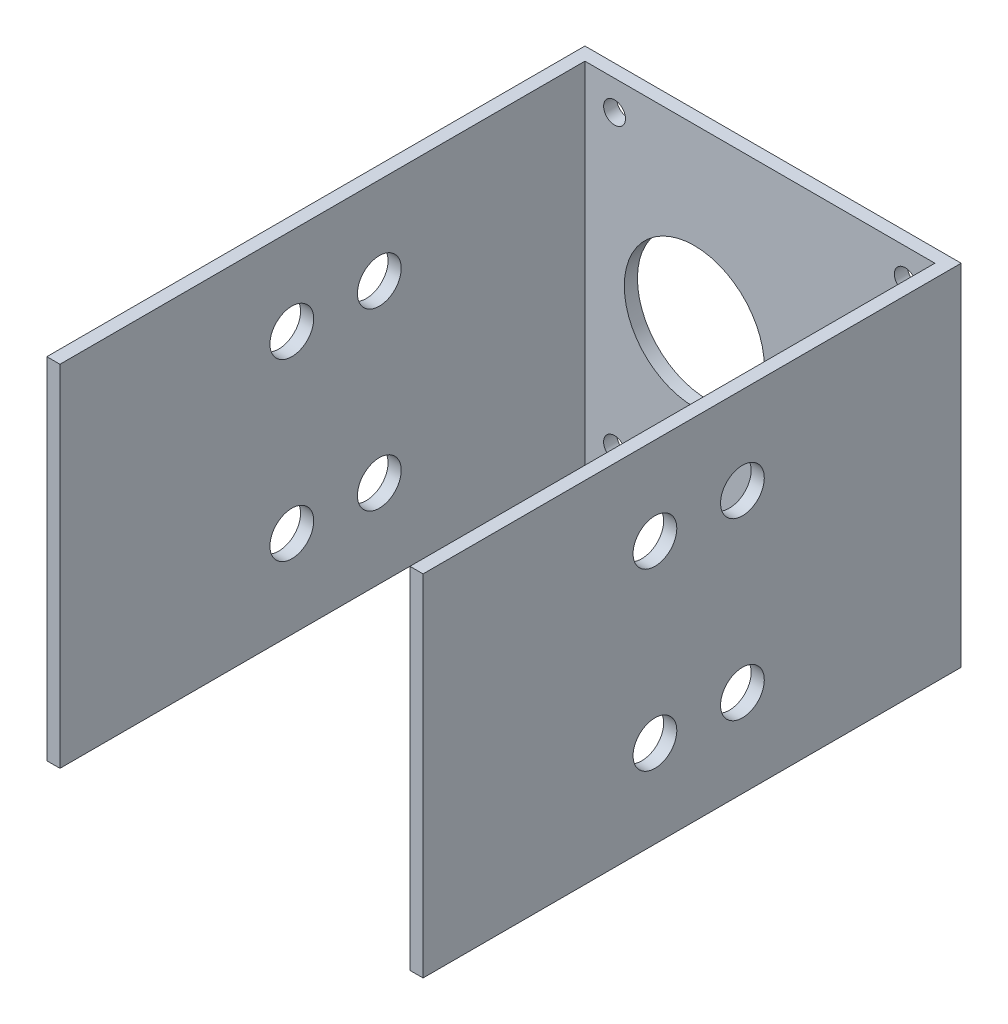
ISO-10303-21;
HEADER;
FILE_DESCRIPTION(('STEP AP214'),'2;1');
FILE_NAME('part.step','',(''),(''),'','','');
FILE_SCHEMA(('AUTOMOTIVE_DESIGN { 1 0 10303 214 1 1 1 1 }'));
ENDSEC;
DATA;
#1=APPLICATION_CONTEXT('core data for automotive mechanical design processes');
#2=APPLICATION_PROTOCOL_DEFINITION('international standard','automotive_design',2000,#1);
#3=PRODUCT_CONTEXT('',#1,'mechanical');
#4=PRODUCT('Part','Part','',(#3));
#5=PRODUCT_RELATED_PRODUCT_CATEGORY('part','',(#4));
#6=PRODUCT_DEFINITION_FORMATION('','',#4);
#7=PRODUCT_DEFINITION_CONTEXT('part definition',#1,'design');
#8=PRODUCT_DEFINITION('design','',#6,#7);
#9=PRODUCT_DEFINITION_SHAPE('','',#8);
#10=(LENGTH_UNIT() NAMED_UNIT(*) SI_UNIT(.MILLI.,.METRE.));
#11=(NAMED_UNIT(*) PLANE_ANGLE_UNIT() SI_UNIT($,.RADIAN.));
#12=(NAMED_UNIT(*) SI_UNIT($,.STERADIAN.) SOLID_ANGLE_UNIT());
#13=UNCERTAINTY_MEASURE_WITH_UNIT(LENGTH_MEASURE(1.E-05),#10,'distance_accuracy_value','');
#14=(GEOMETRIC_REPRESENTATION_CONTEXT(3) GLOBAL_UNCERTAINTY_ASSIGNED_CONTEXT((#13)) GLOBAL_UNIT_ASSIGNED_CONTEXT((#10,
#11,#12)) REPRESENTATION_CONTEXT('',''));
#15=CARTESIAN_POINT('',(0.,0.,0.));
#16=DIRECTION('',(0.,0.,1.));
#17=DIRECTION('',(1.,0.,0.));
#18=AXIS2_PLACEMENT_3D('',#15,#16,#17);
#19=CARTESIAN_POINT('',(0.,0.,3.));
#20=DIRECTION('',(0.,0.,1.));
#21=DIRECTION('',(1.,0.,0.));
#22=AXIS2_PLACEMENT_3D('',#19,#20,#21);
#23=PLANE('',#22);
#24=CARTESIAN_POINT('',(-33.23,33.23,3.));
#25=DIRECTION('',(0.,0.,1.));
#26=DIRECTION('',(1.,0.,0.));
#27=AXIS2_PLACEMENT_3D('',#24,#25,#26);
#28=CIRCLE('',#27,2.5);
#29=CARTESIAN_POINT('',(-30.73,33.23,3.));
#30=VERTEX_POINT('',#29);
#31=EDGE_CURVE('E210',#30,#30,#28,.T.);
#32=ORIENTED_EDGE('',*,*,#31,.F.);
#33=EDGE_LOOP('',(#32));
#34=FACE_BOUND('',#33,.T.);
#35=CARTESIAN_POINT('',(-33.23,-33.23,3.));
#36=DIRECTION('',(0.,0.,1.));
#37=DIRECTION('',(1.,0.,0.));
#38=AXIS2_PLACEMENT_3D('',#35,#36,#37);
#39=CIRCLE('',#38,2.5);
#40=CARTESIAN_POINT('',(-30.73,-33.23,3.));
#41=VERTEX_POINT('',#40);
#42=EDGE_CURVE('E207',#41,#41,#39,.T.);
#43=ORIENTED_EDGE('',*,*,#42,.F.);
#44=EDGE_LOOP('',(#43));
#45=FACE_BOUND('',#44,.T.);
#46=CARTESIAN_POINT('',(33.23,-33.23,3.));
#47=DIRECTION('',(0.,0.,1.));
#48=DIRECTION('',(1.,0.,0.));
#49=AXIS2_PLACEMENT_3D('',#46,#47,#48);
#50=CIRCLE('',#49,2.5);
#51=CARTESIAN_POINT('',(35.73,-33.23,3.));
#52=VERTEX_POINT('',#51);
#53=EDGE_CURVE('E204',#52,#52,#50,.T.);
#54=ORIENTED_EDGE('',*,*,#53,.F.);
#55=EDGE_LOOP('',(#54));
#56=FACE_BOUND('',#55,.T.);
#57=CARTESIAN_POINT('',(33.23,33.23,3.));
#58=DIRECTION('',(0.,0.,1.));
#59=DIRECTION('',(1.,0.,0.));
#60=AXIS2_PLACEMENT_3D('',#57,#58,#59);
#61=CIRCLE('',#60,2.5);
#62=CARTESIAN_POINT('',(35.73,33.23,3.));
#63=VERTEX_POINT('',#62);
#64=EDGE_CURVE('E201',#63,#63,#61,.T.);
#65=ORIENTED_EDGE('',*,*,#64,.F.);
#66=EDGE_LOOP('',(#65));
#67=FACE_BOUND('',#66,.T.);
#68=CARTESIAN_POINT('',(-15.,0.,3.));
#69=DIRECTION('',(0.,0.,1.));
#70=DIRECTION('',(1.,0.,0.));
#71=AXIS2_PLACEMENT_3D('',#68,#69,#70);
#72=CIRCLE('',#71,16.);
#73=CARTESIAN_POINT('',(0.999999999999997,0.,3.));
#74=VERTEX_POINT('',#73);
#75=EDGE_CURVE('E216',#74,#74,#72,.T.);
#76=ORIENTED_EDGE('',*,*,#75,.F.);
#77=EDGE_LOOP('',(#76));
#78=FACE_BOUND('',#77,.T.);
#79=DIRECTION('',(1.,0.,0.));
#80=VECTOR('',#79,1.);
#81=CARTESIAN_POINT('',(-43.,-40.,3.));
#82=LINE('',#81,#80);
#83=CARTESIAN_POINT('',(-40.,-40.,3.));
#84=VERTEX_POINT('',#83);
#85=CARTESIAN_POINT('',(40.,-40.,3.));
#86=VERTEX_POINT('',#85);
#87=EDGE_CURVE('E55',#84,#86,#82,.T.);
#88=ORIENTED_EDGE('',*,*,#87,.T.);
#89=DIRECTION('',(0.,-1.,0.));
#90=VECTOR('',#89,1.);
#91=CARTESIAN_POINT('',(40.,40.,3.));
#92=LINE('',#91,#90);
#93=CARTESIAN_POINT('',(40.,40.,3.));
#94=VERTEX_POINT('',#93);
#95=EDGE_CURVE('E50',#94,#86,#92,.T.);
#96=ORIENTED_EDGE('',*,*,#95,.F.);
#97=DIRECTION('',(-1.,0.,0.));
#98=VECTOR('',#97,1.);
#99=CARTESIAN_POINT('',(-43.,40.,3.));
#100=LINE('',#99,#98);
#101=CARTESIAN_POINT('',(-40.,40.,3.));
#102=VERTEX_POINT('',#101);
#103=EDGE_CURVE('E147',#94,#102,#100,.T.);
#104=ORIENTED_EDGE('',*,*,#103,.T.);
#105=DIRECTION('',(0.,-1.,0.));
#106=VECTOR('',#105,1.);
#107=CARTESIAN_POINT('',(-40.,40.,3.));
#108=LINE('',#107,#106);
#109=EDGE_CURVE('E123',#102,#84,#108,.T.);
#110=ORIENTED_EDGE('',*,*,#109,.T.);
#111=EDGE_LOOP('',(#88,#96,#104,#110));
#112=FACE_BOUND('',#111,.T.);
#113=ADVANCED_FACE('F33',(#34,#45,#56,#67,#78,#112),#23,.T.);
#114=CARTESIAN_POINT('',(43.,40.,3.));
#115=DIRECTION('',(-1.,0.,0.));
#116=DIRECTION('',(0.,-1.,0.));
#117=AXIS2_PLACEMENT_3D('',#114,#115,#116);
#118=PLANE('',#117);
#119=CARTESIAN_POINT('',(43.,-20.,50.));
#120=DIRECTION('',(1.,0.,0.));
#121=DIRECTION('',(0.,1.,0.));
#122=AXIS2_PLACEMENT_3D('',#119,#120,#121);
#123=CIRCLE('',#122,5.);
#124=CARTESIAN_POINT('',(43.,-15.,50.));
#125=VERTEX_POINT('',#124);
#126=EDGE_CURVE('E249',#125,#125,#123,.T.);
#127=ORIENTED_EDGE('',*,*,#126,.F.);
#128=EDGE_LOOP('',(#127));
#129=FACE_BOUND('',#128,.T.);
#130=CARTESIAN_POINT('',(43.,20.,70.));
#131=DIRECTION('',(1.,0.,0.));
#132=DIRECTION('',(0.,1.,0.));
#133=AXIS2_PLACEMENT_3D('',#130,#131,#132);
#134=CIRCLE('',#133,5.);
#135=CARTESIAN_POINT('',(43.,25.,70.));
#136=VERTEX_POINT('',#135);
#137=EDGE_CURVE('E253',#136,#136,#134,.T.);
#138=ORIENTED_EDGE('',*,*,#137,.F.);
#139=EDGE_LOOP('',(#138));
#140=FACE_BOUND('',#139,.T.);
#141=CARTESIAN_POINT('',(43.,-20.,70.));
#142=DIRECTION('',(1.,0.,0.));
#143=DIRECTION('',(0.,1.,0.));
#144=AXIS2_PLACEMENT_3D('',#141,#142,#143);
#145=CIRCLE('',#144,5.);
#146=CARTESIAN_POINT('',(43.,-15.,70.));
#147=VERTEX_POINT('',#146);
#148=EDGE_CURVE('E257',#147,#147,#145,.T.);
#149=ORIENTED_EDGE('',*,*,#148,.F.);
#150=EDGE_LOOP('',(#149));
#151=FACE_BOUND('',#150,.T.);
#152=CARTESIAN_POINT('',(43.,20.,50.));
#153=DIRECTION('',(1.,0.,0.));
#154=DIRECTION('',(0.,1.,0.));
#155=AXIS2_PLACEMENT_3D('',#152,#153,#154);
#156=CIRCLE('',#155,5.);
#157=CARTESIAN_POINT('',(43.,25.,50.));
#158=VERTEX_POINT('',#157);
#159=EDGE_CURVE('E260',#158,#158,#156,.T.);
#160=ORIENTED_EDGE('',*,*,#159,.F.);
#161=EDGE_LOOP('',(#160));
#162=FACE_BOUND('',#161,.T.);
#163=DIRECTION('',(0.,1.,0.));
#164=VECTOR('',#163,1.);
#165=CARTESIAN_POINT('',(43.,40.,0.));
#166=LINE('',#165,#164);
#167=CARTESIAN_POINT('',(43.,-40.,0.));
#168=VERTEX_POINT('',#167);
#169=CARTESIAN_POINT('',(43.,40.,0.));
#170=VERTEX_POINT('',#169);
#171=EDGE_CURVE('E144',#168,#170,#166,.T.);
#172=ORIENTED_EDGE('',*,*,#171,.T.);
#173=DIRECTION('',(0.,0.,-1.));
#174=VECTOR('',#173,1.);
#175=CARTESIAN_POINT('',(43.,40.,3.));
#176=LINE('',#175,#174);
#177=CARTESIAN_POINT('',(43.,40.,123.));
#178=VERTEX_POINT('',#177);
#179=EDGE_CURVE('E11',#178,#170,#176,.T.);
#180=ORIENTED_EDGE('',*,*,#179,.F.);
#181=DIRECTION('',(0.,1.,0.));
#182=VECTOR('',#181,1.);
#183=CARTESIAN_POINT('',(43.,-40.,123.));
#184=LINE('',#183,#182);
#185=CARTESIAN_POINT('',(43.,-40.,123.));
#186=VERTEX_POINT('',#185);
#187=EDGE_CURVE('E121',#186,#178,#184,.T.);
#188=ORIENTED_EDGE('',*,*,#187,.F.);
#189=DIRECTION('',(0.,0.,-1.));
#190=VECTOR('',#189,1.);
#191=CARTESIAN_POINT('',(43.,-40.,3.));
#192=LINE('',#191,#190);
#193=EDGE_CURVE('E119',#186,#168,#192,.T.);
#194=ORIENTED_EDGE('',*,*,#193,.T.);
#195=EDGE_LOOP('',(#172,#180,#188,#194));
#196=FACE_BOUND('',#195,.T.);
#197=ADVANCED_FACE('F35',(#129,#140,#151,#162,#196),#118,.F.);
#198=CARTESIAN_POINT('',(-43.,40.,3.));
#199=DIRECTION('',(0.,-1.,0.));
#200=DIRECTION('',(0.,0.,-1.));
#201=AXIS2_PLACEMENT_3D('',#198,#199,#200);
#202=PLANE('',#201);
#203=DIRECTION('',(-1.,0.,0.));
#204=VECTOR('',#203,1.);
#205=CARTESIAN_POINT('',(-43.,40.,0.));
#206=LINE('',#205,#204);
#207=CARTESIAN_POINT('',(-43.,40.,0.));
#208=VERTEX_POINT('',#207);
#209=EDGE_CURVE('E153',#170,#208,#206,.T.);
#210=ORIENTED_EDGE('',*,*,#209,.T.);
#211=DIRECTION('',(0.,0.,-1.));
#212=VECTOR('',#211,1.);
#213=CARTESIAN_POINT('',(-43.,40.,3.));
#214=LINE('',#213,#212);
#215=CARTESIAN_POINT('',(-43.,40.,123.));
#216=VERTEX_POINT('',#215);
#217=EDGE_CURVE('E42',#216,#208,#214,.T.);
#218=ORIENTED_EDGE('',*,*,#217,.F.);
#219=DIRECTION('',(1.,0.,0.));
#220=VECTOR('',#219,1.);
#221=CARTESIAN_POINT('',(-43.,40.,123.));
#222=LINE('',#221,#220);
#223=CARTESIAN_POINT('',(-40.,40.,123.));
#224=VERTEX_POINT('',#223);
#225=EDGE_CURVE('E134',#216,#224,#222,.T.);
#226=ORIENTED_EDGE('',*,*,#225,.T.);
#227=DIRECTION('',(0.,0.,-1.));
#228=VECTOR('',#227,1.);
#229=CARTESIAN_POINT('',(-40.,40.,123.));
#230=LINE('',#229,#228);
#231=EDGE_CURVE('E140',#224,#102,#230,.T.);
#232=ORIENTED_EDGE('',*,*,#231,.T.);
#233=ORIENTED_EDGE('',*,*,#103,.F.);
#234=DIRECTION('',(0.,0.,-1.));
#235=VECTOR('',#234,1.);
#236=CARTESIAN_POINT('',(40.,40.,123.));
#237=LINE('',#236,#235);
#238=CARTESIAN_POINT('',(40.,40.,123.));
#239=VERTEX_POINT('',#238);
#240=EDGE_CURVE('E115',#239,#94,#237,.T.);
#241=ORIENTED_EDGE('',*,*,#240,.F.);
#242=DIRECTION('',(-1.,0.,0.));
#243=VECTOR('',#242,1.);
#244=CARTESIAN_POINT('',(43.,40.,123.));
#245=LINE('',#244,#243);
#246=EDGE_CURVE('E106',#178,#239,#245,.T.);
#247=ORIENTED_EDGE('',*,*,#246,.F.);
#248=ORIENTED_EDGE('',*,*,#179,.T.);
#249=EDGE_LOOP('',(#210,#218,#226,#232,#233,#241,#247,#248));
#250=FACE_BOUND('',#249,.T.);
#251=ADVANCED_FACE('F220',(#250),#202,.F.);
#252=CARTESIAN_POINT('',(-43.,40.,3.));
#253=DIRECTION('',(1.,0.,0.));
#254=DIRECTION('',(0.,1.,0.));
#255=AXIS2_PLACEMENT_3D('',#252,#253,#254);
#256=PLANE('',#255);
#257=CARTESIAN_POINT('',(-43.,-20.,50.));
#258=DIRECTION('',(1.,0.,0.));
#259=DIRECTION('',(0.,1.,0.));
#260=AXIS2_PLACEMENT_3D('',#257,#258,#259);
#261=CIRCLE('',#260,5.);
#262=CARTESIAN_POINT('',(-43.,-15.,50.));
#263=VERTEX_POINT('',#262);
#264=EDGE_CURVE('E262',#263,#263,#261,.T.);
#265=ORIENTED_EDGE('',*,*,#264,.T.);
#266=EDGE_LOOP('',(#265));
#267=FACE_BOUND('',#266,.T.);
#268=CARTESIAN_POINT('',(-43.,20.,70.));
#269=DIRECTION('',(1.,0.,0.));
#270=DIRECTION('',(0.,1.,0.));
#271=AXIS2_PLACEMENT_3D('',#268,#269,#270);
#272=CIRCLE('',#271,5.);
#273=CARTESIAN_POINT('',(-43.,25.,70.));
#274=VERTEX_POINT('',#273);
#275=EDGE_CURVE('E269',#274,#274,#272,.T.);
#276=ORIENTED_EDGE('',*,*,#275,.T.);
#277=EDGE_LOOP('',(#276));
#278=FACE_BOUND('',#277,.T.);
#279=CARTESIAN_POINT('',(-43.,-20.,70.));
#280=DIRECTION('',(1.,0.,0.));
#281=DIRECTION('',(0.,1.,0.));
#282=AXIS2_PLACEMENT_3D('',#279,#280,#281);
#283=CIRCLE('',#282,5.);
#284=CARTESIAN_POINT('',(-43.,-15.,70.));
#285=VERTEX_POINT('',#284);
#286=EDGE_CURVE('E270',#285,#285,#283,.T.);
#287=ORIENTED_EDGE('',*,*,#286,.T.);
#288=EDGE_LOOP('',(#287));
#289=FACE_BOUND('',#288,.T.);
#290=CARTESIAN_POINT('',(-43.,20.,50.));
#291=DIRECTION('',(1.,0.,0.));
#292=DIRECTION('',(0.,1.,0.));
#293=AXIS2_PLACEMENT_3D('',#290,#291,#292);
#294=CIRCLE('',#293,5.);
#295=CARTESIAN_POINT('',(-43.,25.,50.));
#296=VERTEX_POINT('',#295);
#297=EDGE_CURVE('E168',#296,#296,#294,.T.);
#298=ORIENTED_EDGE('',*,*,#297,.T.);
#299=EDGE_LOOP('',(#298));
#300=FACE_BOUND('',#299,.T.);
#301=DIRECTION('',(0.,-1.,0.));
#302=VECTOR('',#301,1.);
#303=CARTESIAN_POINT('',(-43.,40.,0.));
#304=LINE('',#303,#302);
#305=CARTESIAN_POINT('',(-43.,-40.,0.));
#306=VERTEX_POINT('',#305);
#307=EDGE_CURVE('E155',#208,#306,#304,.T.);
#308=ORIENTED_EDGE('',*,*,#307,.T.);
#309=DIRECTION('',(0.,0.,-1.));
#310=VECTOR('',#309,1.);
#311=CARTESIAN_POINT('',(-43.,-40.,3.));
#312=LINE('',#311,#310);
#313=CARTESIAN_POINT('',(-43.,-40.,123.));
#314=VERTEX_POINT('',#313);
#315=EDGE_CURVE('E159',#314,#306,#312,.T.);
#316=ORIENTED_EDGE('',*,*,#315,.F.);
#317=DIRECTION('',(0.,1.,0.));
#318=VECTOR('',#317,1.);
#319=CARTESIAN_POINT('',(-43.,-40.,123.));
#320=LINE('',#319,#318);
#321=EDGE_CURVE('E131',#314,#216,#320,.T.);
#322=ORIENTED_EDGE('',*,*,#321,.T.);
#323=ORIENTED_EDGE('',*,*,#217,.T.);
#324=EDGE_LOOP('',(#308,#316,#322,#323));
#325=FACE_BOUND('',#324,.T.);
#326=ADVANCED_FACE('F231',(#267,#278,#289,#300,#325),#256,.F.);
#327=CARTESIAN_POINT('',(-43.,-40.,3.));
#328=DIRECTION('',(0.,1.,0.));
#329=DIRECTION('',(0.,0.,1.));
#330=AXIS2_PLACEMENT_3D('',#327,#328,#329);
#331=PLANE('',#330);
#332=DIRECTION('',(1.,0.,0.));
#333=VECTOR('',#332,1.);
#334=CARTESIAN_POINT('',(-43.,-40.,0.));
#335=LINE('',#334,#333);
#336=EDGE_CURVE('E149',#306,#168,#335,.T.);
#337=ORIENTED_EDGE('',*,*,#336,.T.);
#338=ORIENTED_EDGE('',*,*,#193,.F.);
#339=DIRECTION('',(1.,0.,0.));
#340=VECTOR('',#339,1.);
#341=CARTESIAN_POINT('',(40.,-40.,123.));
#342=LINE('',#341,#340);
#343=CARTESIAN_POINT('',(40.,-40.,123.));
#344=VERTEX_POINT('',#343);
#345=EDGE_CURVE('E104',#344,#186,#342,.T.);
#346=ORIENTED_EDGE('',*,*,#345,.F.);
#347=DIRECTION('',(0.,0.,-1.));
#348=VECTOR('',#347,1.);
#349=CARTESIAN_POINT('',(40.,-40.,123.));
#350=LINE('',#349,#348);
#351=EDGE_CURVE('E110',#344,#86,#350,.T.);
#352=ORIENTED_EDGE('',*,*,#351,.T.);
#353=ORIENTED_EDGE('',*,*,#87,.F.);
#354=DIRECTION('',(0.,0.,-1.));
#355=VECTOR('',#354,1.);
#356=CARTESIAN_POINT('',(-40.,-40.,123.));
#357=LINE('',#356,#355);
#358=CARTESIAN_POINT('',(-40.,-40.,123.));
#359=VERTEX_POINT('',#358);
#360=EDGE_CURVE('E142',#359,#84,#357,.T.);
#361=ORIENTED_EDGE('',*,*,#360,.F.);
#362=DIRECTION('',(-1.,0.,0.));
#363=VECTOR('',#362,1.);
#364=CARTESIAN_POINT('',(-40.,-40.,123.));
#365=LINE('',#364,#363);
#366=EDGE_CURVE('E128',#359,#314,#365,.T.);
#367=ORIENTED_EDGE('',*,*,#366,.T.);
#368=ORIENTED_EDGE('',*,*,#315,.T.);
#369=EDGE_LOOP('',(#337,#338,#346,#352,#353,#361,#367,#368));
#370=FACE_BOUND('',#369,.T.);
#371=ADVANCED_FACE('F117',(#370),#331,.F.);
#372=CARTESIAN_POINT('',(0.,0.,0.));
#373=DIRECTION('',(0.,0.,1.));
#374=DIRECTION('',(1.,0.,0.));
#375=AXIS2_PLACEMENT_3D('',#372,#373,#374);
#376=PLANE('',#375);
#377=CARTESIAN_POINT('',(-33.23,33.23,0.));
#378=DIRECTION('',(0.,0.,-1.));
#379=DIRECTION('',(-1.,0.,0.));
#380=AXIS2_PLACEMENT_3D('',#377,#378,#379);
#381=CIRCLE('',#380,2.5);
#382=CARTESIAN_POINT('',(-35.73,33.23,0.));
#383=VERTEX_POINT('',#382);
#384=EDGE_CURVE('E189',#383,#383,#381,.T.);
#385=ORIENTED_EDGE('',*,*,#384,.F.);
#386=EDGE_LOOP('',(#385));
#387=FACE_BOUND('',#386,.T.);
#388=CARTESIAN_POINT('',(-33.23,-33.23,0.));
#389=DIRECTION('',(0.,0.,-1.));
#390=DIRECTION('',(-1.,0.,0.));
#391=AXIS2_PLACEMENT_3D('',#388,#389,#390);
#392=CIRCLE('',#391,2.5);
#393=CARTESIAN_POINT('',(-35.73,-33.23,0.));
#394=VERTEX_POINT('',#393);
#395=EDGE_CURVE('E194',#394,#394,#392,.T.);
#396=ORIENTED_EDGE('',*,*,#395,.F.);
#397=EDGE_LOOP('',(#396));
#398=FACE_BOUND('',#397,.T.);
#399=CARTESIAN_POINT('',(33.23,-33.23,0.));
#400=DIRECTION('',(0.,0.,-1.));
#401=DIRECTION('',(-1.,0.,0.));
#402=AXIS2_PLACEMENT_3D('',#399,#400,#401);
#403=CIRCLE('',#402,2.5);
#404=CARTESIAN_POINT('',(30.73,-33.23,0.));
#405=VERTEX_POINT('',#404);
#406=EDGE_CURVE('E190',#405,#405,#403,.T.);
#407=ORIENTED_EDGE('',*,*,#406,.F.);
#408=EDGE_LOOP('',(#407));
#409=FACE_BOUND('',#408,.T.);
#410=CARTESIAN_POINT('',(33.23,33.23,0.));
#411=DIRECTION('',(0.,0.,-1.));
#412=DIRECTION('',(-1.,0.,0.));
#413=AXIS2_PLACEMENT_3D('',#410,#411,#412);
#414=CIRCLE('',#413,2.5);
#415=CARTESIAN_POINT('',(30.73,33.23,0.));
#416=VERTEX_POINT('',#415);
#417=EDGE_CURVE('E193',#416,#416,#414,.T.);
#418=ORIENTED_EDGE('',*,*,#417,.F.);
#419=EDGE_LOOP('',(#418));
#420=FACE_BOUND('',#419,.T.);
#421=CARTESIAN_POINT('',(-15.,0.,0.));
#422=DIRECTION('',(0.,0.,-1.));
#423=DIRECTION('',(-1.,0.,0.));
#424=AXIS2_PLACEMENT_3D('',#421,#422,#423);
#425=CIRCLE('',#424,16.);
#426=CARTESIAN_POINT('',(-31.,0.,0.));
#427=VERTEX_POINT('',#426);
#428=EDGE_CURVE('E213',#427,#427,#425,.T.);
#429=ORIENTED_EDGE('',*,*,#428,.F.);
#430=EDGE_LOOP('',(#429));
#431=FACE_BOUND('',#430,.T.);
#432=ORIENTED_EDGE('',*,*,#171,.F.);
#433=ORIENTED_EDGE('',*,*,#336,.F.);
#434=ORIENTED_EDGE('',*,*,#307,.F.);
#435=ORIENTED_EDGE('',*,*,#209,.F.);
#436=EDGE_LOOP('',(#432,#433,#434,#435));
#437=FACE_BOUND('',#436,.T.);
#438=ADVANCED_FACE('F236',(#387,#398,#409,#420,#431,#437),#376,.F.);
#439=CARTESIAN_POINT('',(-40.,40.,123.));
#440=DIRECTION('',(1.,0.,0.));
#441=DIRECTION('',(0.,1.,0.));
#442=AXIS2_PLACEMENT_3D('',#439,#440,#441);
#443=PLANE('',#442);
#444=CARTESIAN_POINT('',(-40.,-20.,50.));
#445=DIRECTION('',(1.,0.,0.));
#446=DIRECTION('',(0.,1.,0.));
#447=AXIS2_PLACEMENT_3D('',#444,#445,#446);
#448=CIRCLE('',#447,5.);
#449=CARTESIAN_POINT('',(-40.,-15.,50.));
#450=VERTEX_POINT('',#449);
#451=EDGE_CURVE('E186',#450,#450,#448,.T.);
#452=ORIENTED_EDGE('',*,*,#451,.F.);
#453=EDGE_LOOP('',(#452));
#454=FACE_BOUND('',#453,.T.);
#455=CARTESIAN_POINT('',(-40.,20.,70.));
#456=DIRECTION('',(1.,0.,0.));
#457=DIRECTION('',(0.,1.,0.));
#458=AXIS2_PLACEMENT_3D('',#455,#456,#457);
#459=CIRCLE('',#458,5.);
#460=CARTESIAN_POINT('',(-40.,25.,70.));
#461=VERTEX_POINT('',#460);
#462=EDGE_CURVE('E174',#461,#461,#459,.T.);
#463=ORIENTED_EDGE('',*,*,#462,.F.);
#464=EDGE_LOOP('',(#463));
#465=FACE_BOUND('',#464,.T.);
#466=CARTESIAN_POINT('',(-40.,-20.,70.));
#467=DIRECTION('',(1.,0.,0.));
#468=DIRECTION('',(0.,1.,0.));
#469=AXIS2_PLACEMENT_3D('',#466,#467,#468);
#470=CIRCLE('',#469,5.);
#471=CARTESIAN_POINT('',(-40.,-15.,70.));
#472=VERTEX_POINT('',#471);
#473=EDGE_CURVE('E171',#472,#472,#470,.T.);
#474=ORIENTED_EDGE('',*,*,#473,.F.);
#475=EDGE_LOOP('',(#474));
#476=FACE_BOUND('',#475,.T.);
#477=CARTESIAN_POINT('',(-40.,20.,50.));
#478=DIRECTION('',(1.,0.,0.));
#479=DIRECTION('',(0.,1.,0.));
#480=AXIS2_PLACEMENT_3D('',#477,#478,#479);
#481=CIRCLE('',#480,5.);
#482=CARTESIAN_POINT('',(-40.,25.,50.));
#483=VERTEX_POINT('',#482);
#484=EDGE_CURVE('E167',#483,#483,#481,.T.);
#485=ORIENTED_EDGE('',*,*,#484,.F.);
#486=EDGE_LOOP('',(#485));
#487=FACE_BOUND('',#486,.T.);
#488=ORIENTED_EDGE('',*,*,#109,.F.);
#489=ORIENTED_EDGE('',*,*,#231,.F.);
#490=DIRECTION('',(0.,-1.,0.));
#491=VECTOR('',#490,1.);
#492=CARTESIAN_POINT('',(-40.,40.,123.));
#493=LINE('',#492,#491);
#494=EDGE_CURVE('E137',#224,#359,#493,.T.);
#495=ORIENTED_EDGE('',*,*,#494,.T.);
#496=ORIENTED_EDGE('',*,*,#360,.T.);
#497=EDGE_LOOP('',(#488,#489,#495,#496));
#498=FACE_BOUND('',#497,.T.);
#499=ADVANCED_FACE('F229',(#454,#465,#476,#487,#498),#443,.T.);
#500=CARTESIAN_POINT('',(0.,0.,123.));
#501=DIRECTION('',(0.,0.,-1.));
#502=DIRECTION('',(-1.,0.,0.));
#503=AXIS2_PLACEMENT_3D('',#500,#501,#502);
#504=PLANE('',#503);
#505=ORIENTED_EDGE('',*,*,#366,.F.);
#506=ORIENTED_EDGE('',*,*,#494,.F.);
#507=ORIENTED_EDGE('',*,*,#225,.F.);
#508=ORIENTED_EDGE('',*,*,#321,.F.);
#509=EDGE_LOOP('',(#505,#506,#507,#508));
#510=FACE_BOUND('',#509,.T.);
#511=ADVANCED_FACE('F227',(#510),#504,.F.);
#512=CARTESIAN_POINT('',(40.,40.,123.));
#513=DIRECTION('',(1.,0.,0.));
#514=DIRECTION('',(0.,1.,0.));
#515=AXIS2_PLACEMENT_3D('',#512,#513,#514);
#516=PLANE('',#515);
#517=CARTESIAN_POINT('',(40.,-20.,50.));
#518=DIRECTION('',(1.,0.,0.));
#519=DIRECTION('',(0.,1.,0.));
#520=AXIS2_PLACEMENT_3D('',#517,#518,#519);
#521=CIRCLE('',#520,5.);
#522=CARTESIAN_POINT('',(40.,-15.,50.));
#523=VERTEX_POINT('',#522);
#524=EDGE_CURVE('E37',#523,#523,#521,.T.);
#525=ORIENTED_EDGE('',*,*,#524,.T.);
#526=EDGE_LOOP('',(#525));
#527=FACE_BOUND('',#526,.T.);
#528=CARTESIAN_POINT('',(40.,20.,70.));
#529=DIRECTION('',(1.,0.,0.));
#530=DIRECTION('',(0.,1.,0.));
#531=AXIS2_PLACEMENT_3D('',#528,#529,#530);
#532=CIRCLE('',#531,5.);
#533=CARTESIAN_POINT('',(40.,25.,70.));
#534=VERTEX_POINT('',#533);
#535=EDGE_CURVE('E172',#534,#534,#532,.T.);
#536=ORIENTED_EDGE('',*,*,#535,.T.);
#537=EDGE_LOOP('',(#536));
#538=FACE_BOUND('',#537,.T.);
#539=CARTESIAN_POINT('',(40.,-20.,70.));
#540=DIRECTION('',(1.,0.,0.));
#541=DIRECTION('',(0.,1.,0.));
#542=AXIS2_PLACEMENT_3D('',#539,#540,#541);
#543=CIRCLE('',#542,5.);
#544=CARTESIAN_POINT('',(40.,-15.,70.));
#545=VERTEX_POINT('',#544);
#546=EDGE_CURVE('E169',#545,#545,#543,.T.);
#547=ORIENTED_EDGE('',*,*,#546,.T.);
#548=EDGE_LOOP('',(#547));
#549=FACE_BOUND('',#548,.T.);
#550=CARTESIAN_POINT('',(40.,20.,50.));
#551=DIRECTION('',(1.,0.,0.));
#552=DIRECTION('',(0.,1.,0.));
#553=AXIS2_PLACEMENT_3D('',#550,#551,#552);
#554=CIRCLE('',#553,5.);
#555=CARTESIAN_POINT('',(40.,25.,50.));
#556=VERTEX_POINT('',#555);
#557=EDGE_CURVE('E164',#556,#556,#554,.T.);
#558=ORIENTED_EDGE('',*,*,#557,.T.);
#559=EDGE_LOOP('',(#558));
#560=FACE_BOUND('',#559,.T.);
#561=ORIENTED_EDGE('',*,*,#95,.T.);
#562=ORIENTED_EDGE('',*,*,#351,.F.);
#563=DIRECTION('',(0.,-1.,0.));
#564=VECTOR('',#563,1.);
#565=CARTESIAN_POINT('',(40.,40.,123.));
#566=LINE('',#565,#564);
#567=EDGE_CURVE('E99',#239,#344,#566,.T.);
#568=ORIENTED_EDGE('',*,*,#567,.F.);
#569=ORIENTED_EDGE('',*,*,#240,.T.);
#570=EDGE_LOOP('',(#561,#562,#568,#569));
#571=FACE_BOUND('',#570,.T.);
#572=ADVANCED_FACE('F113',(#527,#538,#549,#560,#571),#516,.F.);
#573=CARTESIAN_POINT('',(0.,0.,123.));
#574=DIRECTION('',(0.,0.,1.));
#575=DIRECTION('',(1.,0.,0.));
#576=AXIS2_PLACEMENT_3D('',#573,#574,#575);
#577=PLANE('',#576);
#578=ORIENTED_EDGE('',*,*,#345,.T.);
#579=ORIENTED_EDGE('',*,*,#187,.T.);
#580=ORIENTED_EDGE('',*,*,#246,.T.);
#581=ORIENTED_EDGE('',*,*,#567,.T.);
#582=EDGE_LOOP('',(#578,#579,#580,#581));
#583=FACE_BOUND('',#582,.T.);
#584=ADVANCED_FACE('F101',(#583),#577,.T.);
#585=CARTESIAN_POINT('',(-15.,0.,120.));
#586=DIRECTION('',(0.,0.,-1.));
#587=DIRECTION('',(-1.,0.,0.));
#588=AXIS2_PLACEMENT_3D('',#585,#586,#587);
#589=CYLINDRICAL_SURFACE('',#588,16.);
#590=ORIENTED_EDGE('',*,*,#75,.T.);
#591=EDGE_LOOP('',(#590));
#592=FACE_BOUND('',#591,.T.);
#593=ORIENTED_EDGE('',*,*,#428,.T.);
#594=EDGE_LOOP('',(#593));
#595=FACE_BOUND('',#594,.T.);
#596=ADVANCED_FACE('F320',(#592,#595),#589,.F.);
#597=CARTESIAN_POINT('',(33.23,33.23,120.));
#598=DIRECTION('',(0.,0.,-1.));
#599=DIRECTION('',(-1.,0.,0.));
#600=AXIS2_PLACEMENT_3D('',#597,#598,#599);
#601=CYLINDRICAL_SURFACE('',#600,2.5);
#602=ORIENTED_EDGE('',*,*,#64,.T.);
#603=EDGE_LOOP('',(#602));
#604=FACE_BOUND('',#603,.T.);
#605=ORIENTED_EDGE('',*,*,#417,.T.);
#606=EDGE_LOOP('',(#605));
#607=FACE_BOUND('',#606,.T.);
#608=ADVANCED_FACE('F417',(#604,#607),#601,.F.);
#609=CARTESIAN_POINT('',(33.23,-33.23,120.));
#610=DIRECTION('',(0.,0.,-1.));
#611=DIRECTION('',(-1.,0.,0.));
#612=AXIS2_PLACEMENT_3D('',#609,#610,#611);
#613=CYLINDRICAL_SURFACE('',#612,2.5);
#614=ORIENTED_EDGE('',*,*,#53,.T.);
#615=EDGE_LOOP('',(#614));
#616=FACE_BOUND('',#615,.T.);
#617=ORIENTED_EDGE('',*,*,#406,.T.);
#618=EDGE_LOOP('',(#617));
#619=FACE_BOUND('',#618,.T.);
#620=ADVANCED_FACE('F408',(#616,#619),#613,.F.);
#621=CARTESIAN_POINT('',(-33.23,-33.23,120.));
#622=DIRECTION('',(0.,0.,-1.));
#623=DIRECTION('',(-1.,0.,0.));
#624=AXIS2_PLACEMENT_3D('',#621,#622,#623);
#625=CYLINDRICAL_SURFACE('',#624,2.5);
#626=ORIENTED_EDGE('',*,*,#42,.T.);
#627=EDGE_LOOP('',(#626));
#628=FACE_BOUND('',#627,.T.);
#629=ORIENTED_EDGE('',*,*,#395,.T.);
#630=EDGE_LOOP('',(#629));
#631=FACE_BOUND('',#630,.T.);
#632=ADVANCED_FACE('F399',(#628,#631),#625,.F.);
#633=CARTESIAN_POINT('',(-33.23,33.23,120.));
#634=DIRECTION('',(0.,0.,-1.));
#635=DIRECTION('',(-1.,0.,0.));
#636=AXIS2_PLACEMENT_3D('',#633,#634,#635);
#637=CYLINDRICAL_SURFACE('',#636,2.5);
#638=ORIENTED_EDGE('',*,*,#31,.T.);
#639=EDGE_LOOP('',(#638));
#640=FACE_BOUND('',#639,.T.);
#641=ORIENTED_EDGE('',*,*,#384,.T.);
#642=EDGE_LOOP('',(#641));
#643=FACE_BOUND('',#642,.T.);
#644=ADVANCED_FACE('F306',(#640,#643),#637,.F.);
#645=CARTESIAN_POINT('',(-43.,20.,50.));
#646=DIRECTION('',(1.,0.,0.));
#647=DIRECTION('',(0.,1.,0.));
#648=AXIS2_PLACEMENT_3D('',#645,#646,#647);
#649=CYLINDRICAL_SURFACE('',#648,5.);
#650=ORIENTED_EDGE('',*,*,#159,.T.);
#651=EDGE_LOOP('',(#650));
#652=FACE_BOUND('',#651,.T.);
#653=ORIENTED_EDGE('',*,*,#557,.F.);
#654=EDGE_LOOP('',(#653));
#655=FACE_BOUND('',#654,.T.);
#656=ADVANCED_FACE('F297',(#652,#655),#649,.F.);
#657=CARTESIAN_POINT('',(-43.,-20.,70.));
#658=DIRECTION('',(1.,0.,0.));
#659=DIRECTION('',(0.,1.,0.));
#660=AXIS2_PLACEMENT_3D('',#657,#658,#659);
#661=CYLINDRICAL_SURFACE('',#660,5.);
#662=ORIENTED_EDGE('',*,*,#148,.T.);
#663=EDGE_LOOP('',(#662));
#664=FACE_BOUND('',#663,.T.);
#665=ORIENTED_EDGE('',*,*,#546,.F.);
#666=EDGE_LOOP('',(#665));
#667=FACE_BOUND('',#666,.T.);
#668=ADVANCED_FACE('F285',(#664,#667),#661,.F.);
#669=CARTESIAN_POINT('',(-43.,20.,70.));
#670=DIRECTION('',(1.,0.,0.));
#671=DIRECTION('',(0.,1.,0.));
#672=AXIS2_PLACEMENT_3D('',#669,#670,#671);
#673=CYLINDRICAL_SURFACE('',#672,5.);
#674=ORIENTED_EDGE('',*,*,#137,.T.);
#675=EDGE_LOOP('',(#674));
#676=FACE_BOUND('',#675,.T.);
#677=ORIENTED_EDGE('',*,*,#535,.F.);
#678=EDGE_LOOP('',(#677));
#679=FACE_BOUND('',#678,.T.);
#680=ADVANCED_FACE('F293',(#676,#679),#673,.F.);
#681=CARTESIAN_POINT('',(-43.,-20.,50.));
#682=DIRECTION('',(1.,0.,0.));
#683=DIRECTION('',(0.,1.,0.));
#684=AXIS2_PLACEMENT_3D('',#681,#682,#683);
#685=CYLINDRICAL_SURFACE('',#684,5.);
#686=ORIENTED_EDGE('',*,*,#126,.T.);
#687=EDGE_LOOP('',(#686));
#688=FACE_BOUND('',#687,.T.);
#689=ORIENTED_EDGE('',*,*,#524,.F.);
#690=EDGE_LOOP('',(#689));
#691=FACE_BOUND('',#690,.T.);
#692=ADVANCED_FACE('F294',(#688,#691),#685,.F.);
#693=ORIENTED_EDGE('',*,*,#484,.T.);
#694=EDGE_LOOP('',(#693));
#695=FACE_BOUND('',#694,.T.);
#696=ORIENTED_EDGE('',*,*,#297,.F.);
#697=EDGE_LOOP('',(#696));
#698=FACE_BOUND('',#697,.T.);
#699=ADVANCED_FACE('F283',(#695,#698),#649,.F.);
#700=ORIENTED_EDGE('',*,*,#473,.T.);
#701=EDGE_LOOP('',(#700));
#702=FACE_BOUND('',#701,.T.);
#703=ORIENTED_EDGE('',*,*,#286,.F.);
#704=EDGE_LOOP('',(#703));
#705=FACE_BOUND('',#704,.T.);
#706=ADVANCED_FACE('F280',(#702,#705),#661,.F.);
#707=ORIENTED_EDGE('',*,*,#462,.T.);
#708=EDGE_LOOP('',(#707));
#709=FACE_BOUND('',#708,.T.);
#710=ORIENTED_EDGE('',*,*,#275,.F.);
#711=EDGE_LOOP('',(#710));
#712=FACE_BOUND('',#711,.T.);
#713=ADVANCED_FACE('F282',(#709,#712),#673,.F.);
#714=ORIENTED_EDGE('',*,*,#451,.T.);
#715=EDGE_LOOP('',(#714));
#716=FACE_BOUND('',#715,.T.);
#717=ORIENTED_EDGE('',*,*,#264,.F.);
#718=EDGE_LOOP('',(#717));
#719=FACE_BOUND('',#718,.T.);
#720=ADVANCED_FACE('F290',(#716,#719),#685,.F.);
#721=CLOSED_SHELL('',(#113,#197,#251,#326,#371,#438,#499,#511,#572,#584,#596,#608,#620,#632,
#644,#656,#668,#680,#692,#699,#706,#713,#720));
#722=MANIFOLD_SOLID_BREP('B2',#721);
#723=ADVANCED_BREP_SHAPE_REPRESENTATION('',(#18,#722),#14);
#724=SHAPE_DEFINITION_REPRESENTATION(#9,#723);
ENDSEC;
END-ISO-10303-21;
